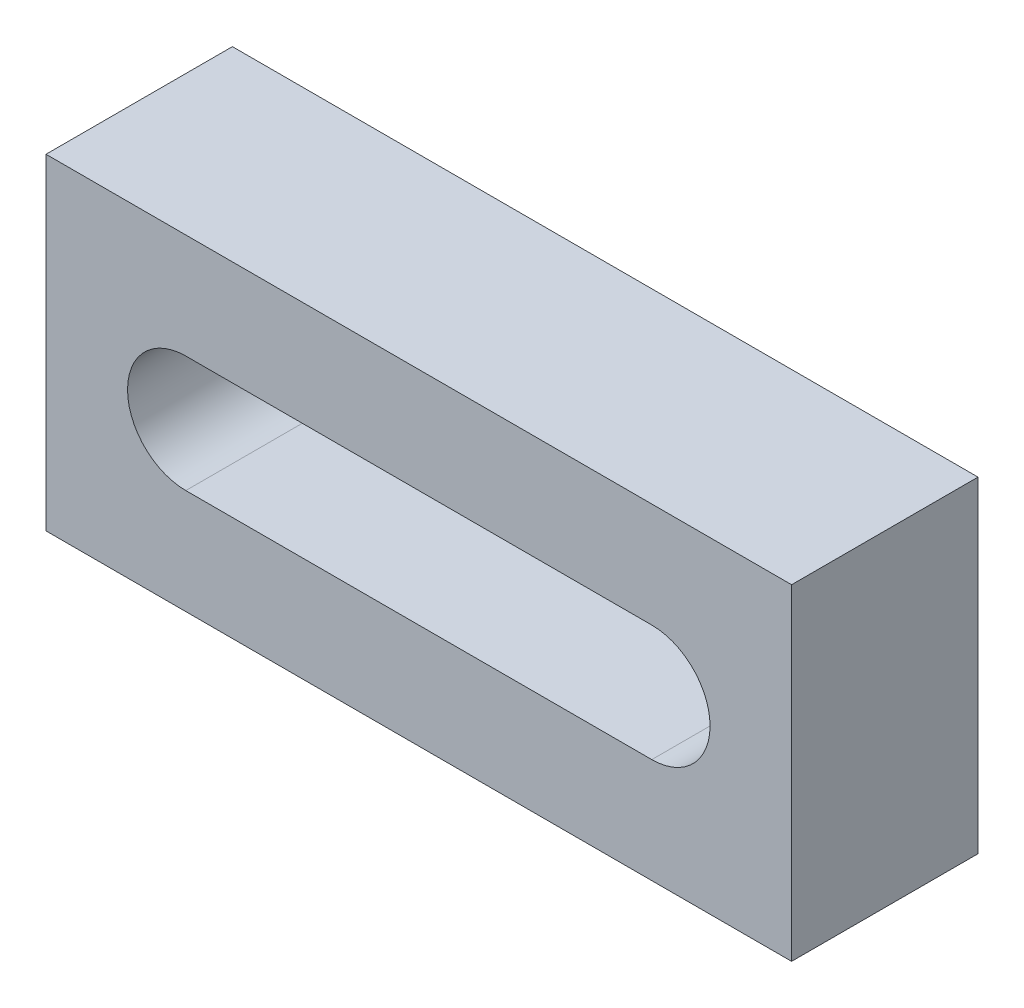
ISO-10303-21;
HEADER;
FILE_DESCRIPTION(('STEP AP214'),'2;1');
FILE_NAME('part.step','',(''),(''),'','','');
FILE_SCHEMA(('AUTOMOTIVE_DESIGN { 1 0 10303 214 1 1 1 1 }'));
ENDSEC;
DATA;
#1=APPLICATION_CONTEXT('core data for automotive mechanical design processes');
#2=APPLICATION_PROTOCOL_DEFINITION('international standard','automotive_design',2000,#1);
#3=PRODUCT_CONTEXT('',#1,'mechanical');
#4=PRODUCT('Part','Part','',(#3));
#5=PRODUCT_RELATED_PRODUCT_CATEGORY('part','',(#4));
#6=PRODUCT_DEFINITION_FORMATION('','',#4);
#7=PRODUCT_DEFINITION_CONTEXT('part definition',#1,'design');
#8=PRODUCT_DEFINITION('design','',#6,#7);
#9=PRODUCT_DEFINITION_SHAPE('','',#8);
#10=(LENGTH_UNIT() NAMED_UNIT(*) SI_UNIT(.MILLI.,.METRE.));
#11=(NAMED_UNIT(*) PLANE_ANGLE_UNIT() SI_UNIT($,.RADIAN.));
#12=(NAMED_UNIT(*) SI_UNIT($,.STERADIAN.) SOLID_ANGLE_UNIT());
#13=UNCERTAINTY_MEASURE_WITH_UNIT(LENGTH_MEASURE(1.E-05),#10,'distance_accuracy_value','');
#14=(GEOMETRIC_REPRESENTATION_CONTEXT(3) GLOBAL_UNCERTAINTY_ASSIGNED_CONTEXT((#13)) GLOBAL_UNIT_ASSIGNED_CONTEXT((#10,
#11,#12)) REPRESENTATION_CONTEXT('',''));
#15=CARTESIAN_POINT('',(0.,0.,0.));
#16=DIRECTION('',(0.,0.,1.));
#17=DIRECTION('',(1.,0.,0.));
#18=AXIS2_PLACEMENT_3D('',#15,#16,#17);
#19=CARTESIAN_POINT('',(0.,0.,10.));
#20=DIRECTION('',(0.,0.,1.));
#21=DIRECTION('',(1.,0.,0.));
#22=AXIS2_PLACEMENT_3D('',#19,#20,#21);
#23=PLANE('',#22);
#24=DIRECTION('',(0.,1.,0.));
#25=VECTOR('',#24,1.);
#26=CARTESIAN_POINT('',(40.,17.5,10.));
#27=LINE('',#26,#25);
#28=CARTESIAN_POINT('',(40.,-17.5,10.));
#29=VERTEX_POINT('',#28);
#30=CARTESIAN_POINT('',(40.,17.5,10.));
#31=VERTEX_POINT('',#30);
#32=EDGE_CURVE('E136',#29,#31,#27,.T.);
#33=ORIENTED_EDGE('',*,*,#32,.T.);
#34=DIRECTION('',(-1.,0.,0.));
#35=VECTOR('',#34,1.);
#36=CARTESIAN_POINT('',(-40.,17.5,10.));
#37=LINE('',#36,#35);
#38=CARTESIAN_POINT('',(-40.,17.5,10.));
#39=VERTEX_POINT('',#38);
#40=EDGE_CURVE('E139',#31,#39,#37,.T.);
#41=ORIENTED_EDGE('',*,*,#40,.T.);
#42=DIRECTION('',(0.,-1.,0.));
#43=VECTOR('',#42,1.);
#44=CARTESIAN_POINT('',(-40.,17.5,10.));
#45=LINE('',#44,#43);
#46=CARTESIAN_POINT('',(-40.,-17.5,10.));
#47=VERTEX_POINT('',#46);
#48=EDGE_CURVE('E142',#39,#47,#45,.T.);
#49=ORIENTED_EDGE('',*,*,#48,.T.);
#50=DIRECTION('',(1.,0.,0.));
#51=VECTOR('',#50,1.);
#52=CARTESIAN_POINT('',(-40.,-17.5,10.));
#53=LINE('',#52,#51);
#54=EDGE_CURVE('E144',#47,#29,#53,.T.);
#55=ORIENTED_EDGE('',*,*,#54,.T.);
#56=EDGE_LOOP('',(#33,#41,#49,#55));
#57=FACE_BOUND('',#56,.T.);
#58=DIRECTION('',(1.,0.,0.));
#59=VECTOR('',#58,1.);
#60=CARTESIAN_POINT('',(-25.,-6.25,10.));
#61=LINE('',#60,#59);
#62=CARTESIAN_POINT('',(-25.,-6.25,10.));
#63=VERTEX_POINT('',#62);
#64=CARTESIAN_POINT('',(25.,-6.25,10.));
#65=VERTEX_POINT('',#64);
#66=EDGE_CURVE('E108',#63,#65,#61,.T.);
#67=ORIENTED_EDGE('',*,*,#66,.F.);
#68=CARTESIAN_POINT('',(-25.,0.,10.));
#69=DIRECTION('',(0.,0.,1.));
#70=DIRECTION('',(1.,0.,0.));
#71=AXIS2_PLACEMENT_3D('',#68,#69,#70);
#72=CIRCLE('',#71,6.25);
#73=CARTESIAN_POINT('',(-25.,6.25,10.));
#74=VERTEX_POINT('',#73);
#75=EDGE_CURVE('E100',#74,#63,#72,.T.);
#76=ORIENTED_EDGE('',*,*,#75,.F.);
#77=DIRECTION('',(-1.,0.,0.));
#78=VECTOR('',#77,1.);
#79=CARTESIAN_POINT('',(-25.,6.25,10.));
#80=LINE('',#79,#78);
#81=CARTESIAN_POINT('',(25.,6.25000000000001,10.));
#82=VERTEX_POINT('',#81);
#83=EDGE_CURVE('E122',#82,#74,#80,.T.);
#84=ORIENTED_EDGE('',*,*,#83,.F.);
#85=CARTESIAN_POINT('',(25.,0.,10.));
#86=DIRECTION('',(0.,0.,1.));
#87=DIRECTION('',(1.,0.,0.));
#88=AXIS2_PLACEMENT_3D('',#85,#86,#87);
#89=CIRCLE('',#88,6.25);
#90=EDGE_CURVE('E120',#65,#82,#89,.T.);
#91=ORIENTED_EDGE('',*,*,#90,.F.);
#92=EDGE_LOOP('',(#67,#76,#84,#91));
#93=FACE_BOUND('',#92,.T.);
#94=ADVANCED_FACE('F35',(#57,#93),#23,.T.);
#95=CARTESIAN_POINT('',(0.,0.,-10.));
#96=DIRECTION('',(0.,0.,1.));
#97=DIRECTION('',(1.,0.,0.));
#98=AXIS2_PLACEMENT_3D('',#95,#96,#97);
#99=PLANE('',#98);
#100=DIRECTION('',(0.,1.,0.));
#101=VECTOR('',#100,1.);
#102=CARTESIAN_POINT('',(40.,17.5,-10.));
#103=LINE('',#102,#101);
#104=CARTESIAN_POINT('',(40.,-17.5,-10.));
#105=VERTEX_POINT('',#104);
#106=CARTESIAN_POINT('',(40.,17.5,-10.));
#107=VERTEX_POINT('',#106);
#108=EDGE_CURVE('E116',#105,#107,#103,.T.);
#109=ORIENTED_EDGE('',*,*,#108,.F.);
#110=DIRECTION('',(1.,0.,0.));
#111=VECTOR('',#110,1.);
#112=CARTESIAN_POINT('',(-40.,-17.5,-10.));
#113=LINE('',#112,#111);
#114=CARTESIAN_POINT('',(-40.,-17.5,-10.));
#115=VERTEX_POINT('',#114);
#116=EDGE_CURVE('E140',#115,#105,#113,.T.);
#117=ORIENTED_EDGE('',*,*,#116,.F.);
#118=DIRECTION('',(0.,-1.,0.));
#119=VECTOR('',#118,1.);
#120=CARTESIAN_POINT('',(-40.,17.5,-10.));
#121=LINE('',#120,#119);
#122=CARTESIAN_POINT('',(-40.,17.5,-10.));
#123=VERTEX_POINT('',#122);
#124=EDGE_CURVE('E151',#123,#115,#121,.T.);
#125=ORIENTED_EDGE('',*,*,#124,.F.);
#126=DIRECTION('',(-1.,0.,0.));
#127=VECTOR('',#126,1.);
#128=CARTESIAN_POINT('',(-40.,17.5,-10.));
#129=LINE('',#128,#127);
#130=EDGE_CURVE('E149',#107,#123,#129,.T.);
#131=ORIENTED_EDGE('',*,*,#130,.F.);
#132=EDGE_LOOP('',(#109,#117,#125,#131));
#133=FACE_BOUND('',#132,.T.);
#134=CARTESIAN_POINT('',(-25.,0.,-10.));
#135=DIRECTION('',(0.,0.,1.));
#136=DIRECTION('',(1.,0.,0.));
#137=AXIS2_PLACEMENT_3D('',#134,#135,#136);
#138=CIRCLE('',#137,6.25);
#139=CARTESIAN_POINT('',(-25.,6.25,-10.));
#140=VERTEX_POINT('',#139);
#141=CARTESIAN_POINT('',(-25.,-6.25,-10.));
#142=VERTEX_POINT('',#141);
#143=EDGE_CURVE('E58',#140,#142,#138,.T.);
#144=ORIENTED_EDGE('',*,*,#143,.T.);
#145=DIRECTION('',(1.,0.,0.));
#146=VECTOR('',#145,1.);
#147=CARTESIAN_POINT('',(-25.,-6.25,-10.));
#148=LINE('',#147,#146);
#149=CARTESIAN_POINT('',(25.,-6.25,-10.));
#150=VERTEX_POINT('',#149);
#151=EDGE_CURVE('E115',#142,#150,#148,.T.);
#152=ORIENTED_EDGE('',*,*,#151,.T.);
#153=CARTESIAN_POINT('',(25.,0.,-10.));
#154=DIRECTION('',(0.,0.,1.));
#155=DIRECTION('',(1.,0.,0.));
#156=AXIS2_PLACEMENT_3D('',#153,#154,#155);
#157=CIRCLE('',#156,6.25);
#158=CARTESIAN_POINT('',(25.,6.25000000000001,-10.));
#159=VERTEX_POINT('',#158);
#160=EDGE_CURVE('E128',#150,#159,#157,.T.);
#161=ORIENTED_EDGE('',*,*,#160,.T.);
#162=DIRECTION('',(-1.,0.,0.));
#163=VECTOR('',#162,1.);
#164=CARTESIAN_POINT('',(-25.,6.25,-10.));
#165=LINE('',#164,#163);
#166=EDGE_CURVE('E109',#159,#140,#165,.T.);
#167=ORIENTED_EDGE('',*,*,#166,.T.);
#168=EDGE_LOOP('',(#144,#152,#161,#167));
#169=FACE_BOUND('',#168,.T.);
#170=ADVANCED_FACE('F169',(#133,#169),#99,.F.);
#171=CARTESIAN_POINT('',(40.,17.5,10.));
#172=DIRECTION('',(-1.,0.,0.));
#173=DIRECTION('',(0.,0.,1.));
#174=AXIS2_PLACEMENT_3D('',#171,#172,#173);
#175=PLANE('',#174);
#176=ORIENTED_EDGE('',*,*,#108,.T.);
#177=DIRECTION('',(0.,0.,-1.));
#178=VECTOR('',#177,1.);
#179=CARTESIAN_POINT('',(40.,17.5,10.));
#180=LINE('',#179,#178);
#181=EDGE_CURVE('E11',#31,#107,#180,.T.);
#182=ORIENTED_EDGE('',*,*,#181,.F.);
#183=ORIENTED_EDGE('',*,*,#32,.F.);
#184=DIRECTION('',(0.,0.,-1.));
#185=VECTOR('',#184,1.);
#186=CARTESIAN_POINT('',(40.,-17.5,10.));
#187=LINE('',#186,#185);
#188=EDGE_CURVE('E146',#29,#105,#187,.T.);
#189=ORIENTED_EDGE('',*,*,#188,.T.);
#190=EDGE_LOOP('',(#176,#182,#183,#189));
#191=FACE_BOUND('',#190,.T.);
#192=ADVANCED_FACE('F37',(#191),#175,.F.);
#193=CARTESIAN_POINT('',(-40.,17.5,10.));
#194=DIRECTION('',(0.,-1.,0.));
#195=DIRECTION('',(1.,0.,0.));
#196=AXIS2_PLACEMENT_3D('',#193,#194,#195);
#197=PLANE('',#196);
#198=ORIENTED_EDGE('',*,*,#130,.T.);
#199=DIRECTION('',(0.,0.,-1.));
#200=VECTOR('',#199,1.);
#201=CARTESIAN_POINT('',(-40.,17.5,10.));
#202=LINE('',#201,#200);
#203=EDGE_CURVE('E43',#39,#123,#202,.T.);
#204=ORIENTED_EDGE('',*,*,#203,.F.);
#205=ORIENTED_EDGE('',*,*,#40,.F.);
#206=ORIENTED_EDGE('',*,*,#181,.T.);
#207=EDGE_LOOP('',(#198,#204,#205,#206));
#208=FACE_BOUND('',#207,.T.);
#209=ADVANCED_FACE('F179',(#208),#197,.F.);
#210=CARTESIAN_POINT('',(-40.,17.5,10.));
#211=DIRECTION('',(1.,0.,0.));
#212=DIRECTION('',(0.,1.,0.));
#213=AXIS2_PLACEMENT_3D('',#210,#211,#212);
#214=PLANE('',#213);
#215=ORIENTED_EDGE('',*,*,#124,.T.);
#216=DIRECTION('',(0.,0.,-1.));
#217=VECTOR('',#216,1.);
#218=CARTESIAN_POINT('',(-40.,-17.5,10.));
#219=LINE('',#218,#217);
#220=EDGE_CURVE('E156',#47,#115,#219,.T.);
#221=ORIENTED_EDGE('',*,*,#220,.F.);
#222=ORIENTED_EDGE('',*,*,#48,.F.);
#223=ORIENTED_EDGE('',*,*,#203,.T.);
#224=EDGE_LOOP('',(#215,#221,#222,#223));
#225=FACE_BOUND('',#224,.T.);
#226=ADVANCED_FACE('F163',(#225),#214,.F.);
#227=CARTESIAN_POINT('',(-40.,-17.5,10.));
#228=DIRECTION('',(0.,1.,0.));
#229=DIRECTION('',(0.,0.,1.));
#230=AXIS2_PLACEMENT_3D('',#227,#228,#229);
#231=PLANE('',#230);
#232=ORIENTED_EDGE('',*,*,#116,.T.);
#233=ORIENTED_EDGE('',*,*,#188,.F.);
#234=ORIENTED_EDGE('',*,*,#54,.F.);
#235=ORIENTED_EDGE('',*,*,#220,.T.);
#236=EDGE_LOOP('',(#232,#233,#234,#235));
#237=FACE_BOUND('',#236,.T.);
#238=ADVANCED_FACE('F173',(#237),#231,.F.);
#239=CARTESIAN_POINT('',(-25.,0.,10.));
#240=DIRECTION('',(0.,0.,-1.));
#241=DIRECTION('',(-1.,0.,0.));
#242=AXIS2_PLACEMENT_3D('',#239,#240,#241);
#243=CYLINDRICAL_SURFACE('',#242,6.25);
#244=ORIENTED_EDGE('',*,*,#143,.F.);
#245=DIRECTION('',(0.,0.,-1.));
#246=VECTOR('',#245,1.);
#247=CARTESIAN_POINT('',(-25.,6.25,10.));
#248=LINE('',#247,#246);
#249=EDGE_CURVE('E104',#74,#140,#248,.T.);
#250=ORIENTED_EDGE('',*,*,#249,.F.);
#251=ORIENTED_EDGE('',*,*,#75,.T.);
#252=DIRECTION('',(0.,0.,-1.));
#253=VECTOR('',#252,1.);
#254=CARTESIAN_POINT('',(-25.,-6.25,10.));
#255=LINE('',#254,#253);
#256=EDGE_CURVE('E103',#63,#142,#255,.T.);
#257=ORIENTED_EDGE('',*,*,#256,.T.);
#258=EDGE_LOOP('',(#244,#250,#251,#257));
#259=FACE_BOUND('',#258,.T.);
#260=ADVANCED_FACE('F102',(#259),#243,.F.);
#261=CARTESIAN_POINT('',(-25.,-6.25,10.));
#262=DIRECTION('',(0.,1.,0.));
#263=DIRECTION('',(-1.,0.,0.));
#264=AXIS2_PLACEMENT_3D('',#261,#262,#263);
#265=PLANE('',#264);
#266=ORIENTED_EDGE('',*,*,#151,.F.);
#267=ORIENTED_EDGE('',*,*,#256,.F.);
#268=ORIENTED_EDGE('',*,*,#66,.T.);
#269=DIRECTION('',(0.,0.,-1.));
#270=VECTOR('',#269,1.);
#271=CARTESIAN_POINT('',(25.,-6.25,10.));
#272=LINE('',#271,#270);
#273=EDGE_CURVE('E117',#65,#150,#272,.T.);
#274=ORIENTED_EDGE('',*,*,#273,.T.);
#275=EDGE_LOOP('',(#266,#267,#268,#274));
#276=FACE_BOUND('',#275,.T.);
#277=ADVANCED_FACE('F112',(#276),#265,.T.);
#278=CARTESIAN_POINT('',(25.,0.,10.));
#279=DIRECTION('',(0.,0.,-1.));
#280=DIRECTION('',(-1.,0.,0.));
#281=AXIS2_PLACEMENT_3D('',#278,#279,#280);
#282=CYLINDRICAL_SURFACE('',#281,6.25);
#283=ORIENTED_EDGE('',*,*,#160,.F.);
#284=ORIENTED_EDGE('',*,*,#273,.F.);
#285=ORIENTED_EDGE('',*,*,#90,.T.);
#286=DIRECTION('',(0.,0.,-1.));
#287=VECTOR('',#286,1.);
#288=CARTESIAN_POINT('',(25.,6.25000000000001,10.));
#289=LINE('',#288,#287);
#290=EDGE_CURVE('E50',#82,#159,#289,.T.);
#291=ORIENTED_EDGE('',*,*,#290,.T.);
#292=EDGE_LOOP('',(#283,#284,#285,#291));
#293=FACE_BOUND('',#292,.T.);
#294=ADVANCED_FACE('F202',(#293),#282,.F.);
#295=CARTESIAN_POINT('',(-25.,6.25,10.));
#296=DIRECTION('',(0.,-1.,0.));
#297=DIRECTION('',(1.,0.,0.));
#298=AXIS2_PLACEMENT_3D('',#295,#296,#297);
#299=PLANE('',#298);
#300=ORIENTED_EDGE('',*,*,#166,.F.);
#301=ORIENTED_EDGE('',*,*,#290,.F.);
#302=ORIENTED_EDGE('',*,*,#83,.T.);
#303=ORIENTED_EDGE('',*,*,#249,.T.);
#304=EDGE_LOOP('',(#300,#301,#302,#303));
#305=FACE_BOUND('',#304,.T.);
#306=ADVANCED_FACE('F206',(#305),#299,.T.);
#307=CLOSED_SHELL('',(#94,#170,#192,#209,#226,#238,#260,#277,#294,#306));
#308=MANIFOLD_SOLID_BREP('B2',#307);
#309=ADVANCED_BREP_SHAPE_REPRESENTATION('',(#18,#308),#14);
#310=SHAPE_DEFINITION_REPRESENTATION(#9,#309);
ENDSEC;
END-ISO-10303-21;
